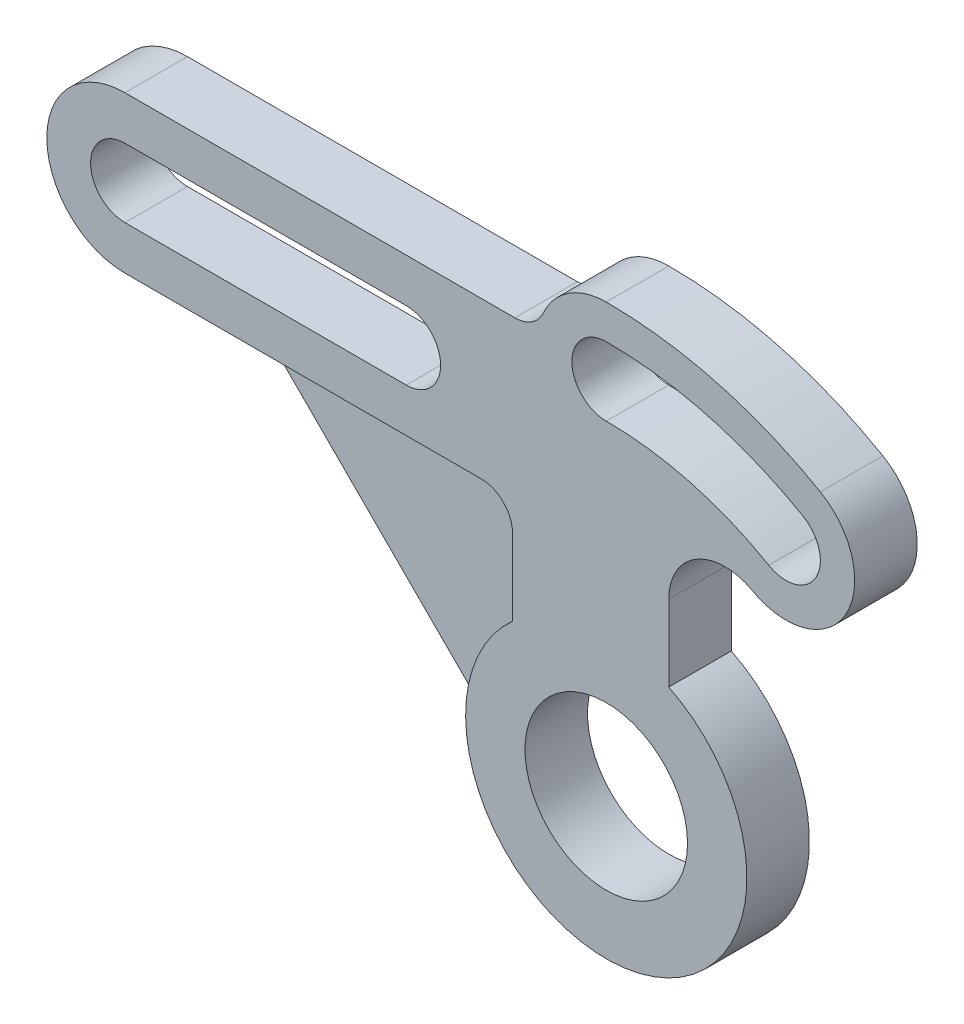
ISO-10303-21;
HEADER;
FILE_DESCRIPTION(('STEP AP214'),'2;1');
FILE_NAME('part.step','',(''),(''),'','','');
FILE_SCHEMA(('AUTOMOTIVE_DESIGN { 1 0 10303 214 1 1 1 1 }'));
ENDSEC;
DATA;
#1=APPLICATION_CONTEXT('core data for automotive mechanical design processes');
#2=APPLICATION_PROTOCOL_DEFINITION('international standard','automotive_design',2000,#1);
#3=PRODUCT_CONTEXT('',#1,'mechanical');
#4=PRODUCT('Part','Part','',(#3));
#5=PRODUCT_RELATED_PRODUCT_CATEGORY('part','',(#4));
#6=PRODUCT_DEFINITION_FORMATION('','',#4);
#7=PRODUCT_DEFINITION_CONTEXT('part definition',#1,'design');
#8=PRODUCT_DEFINITION('design','',#6,#7);
#9=PRODUCT_DEFINITION_SHAPE('','',#8);
#10=(LENGTH_UNIT() NAMED_UNIT(*) SI_UNIT(.MILLI.,.METRE.));
#11=(NAMED_UNIT(*) PLANE_ANGLE_UNIT() SI_UNIT($,.RADIAN.));
#12=(NAMED_UNIT(*) SI_UNIT($,.STERADIAN.) SOLID_ANGLE_UNIT());
#13=UNCERTAINTY_MEASURE_WITH_UNIT(LENGTH_MEASURE(1.E-05),#10,'distance_accuracy_value','');
#14=(GEOMETRIC_REPRESENTATION_CONTEXT(3) GLOBAL_UNCERTAINTY_ASSIGNED_CONTEXT((#13)) GLOBAL_UNIT_ASSIGNED_CONTEXT((#10,
#11,#12)) REPRESENTATION_CONTEXT('',''));
#15=CARTESIAN_POINT('',(0.,0.,0.));
#16=DIRECTION('',(0.,0.,1.));
#17=DIRECTION('',(1.,0.,0.));
#18=AXIS2_PLACEMENT_3D('',#15,#16,#17);
#19=CARTESIAN_POINT('',(-40.,-35.,10.));
#20=DIRECTION('',(0.,0.,-1.));
#21=DIRECTION('',(-1.,0.,0.));
#22=AXIS2_PLACEMENT_3D('',#19,#20,#21);
#23=CYLINDRICAL_SURFACE('',#22,10.);
#24=CARTESIAN_POINT('',(-40.,-35.,-5.));
#25=DIRECTION('',(0.,0.,1.));
#26=DIRECTION('',(1.,0.,0.));
#27=AXIS2_PLACEMENT_3D('',#24,#25,#26);
#28=CIRCLE('',#27,10.);
#29=CARTESIAN_POINT('',(-40.,-25.,-5.));
#30=VERTEX_POINT('',#29);
#31=CARTESIAN_POINT('',(-30.,-35.0000000000001,-5.));
#32=VERTEX_POINT('',#31);
#33=EDGE_CURVE('E516',#30,#32,#28,.F.);
#34=ORIENTED_EDGE('',*,*,#33,.F.);
#35=DIRECTION('',(0.,0.,-1.));
#36=VECTOR('',#35,1.);
#37=CARTESIAN_POINT('',(-40.,-25.,10.));
#38=LINE('',#37,#36);
#39=CARTESIAN_POINT('',(-40.,-25.,-10.));
#40=VERTEX_POINT('',#39);
#41=EDGE_CURVE('E437',#30,#40,#38,.T.);
#42=ORIENTED_EDGE('',*,*,#41,.T.);
#43=CARTESIAN_POINT('',(-40.,-35.,-10.));
#44=DIRECTION('',(0.,0.,1.));
#45=DIRECTION('',(1.,0.,0.));
#46=AXIS2_PLACEMENT_3D('',#43,#44,#45);
#47=CIRCLE('',#46,10.);
#48=CARTESIAN_POINT('',(-30.,-35.0000000000001,-10.));
#49=VERTEX_POINT('',#48);
#50=EDGE_CURVE('E352',#40,#49,#47,.F.);
#51=ORIENTED_EDGE('',*,*,#50,.T.);
#52=DIRECTION('',(0.,0.,-1.));
#53=VECTOR('',#52,1.);
#54=CARTESIAN_POINT('',(-30.,-35.0000000000001,10.));
#55=LINE('',#54,#53);
#56=EDGE_CURVE('E432',#32,#49,#55,.T.);
#57=ORIENTED_EDGE('',*,*,#56,.F.);
#58=EDGE_LOOP('',(#34,#42,#51,#57));
#59=FACE_BOUND('',#58,.T.);
#60=ADVANCED_FACE('F40',(#59),#23,.F.);
#61=CARTESIAN_POINT('',(-30.,0.,10.));
#62=DIRECTION('',(1.,0.,0.));
#63=DIRECTION('',(0.,1.,0.));
#64=AXIS2_PLACEMENT_3D('',#61,#62,#63);
#65=PLANE('',#64);
#66=DIRECTION('',(0.,-1.,0.));
#67=VECTOR('',#66,1.);
#68=CARTESIAN_POINT('',(-30.,0.,-5.));
#69=LINE('',#68,#67);
#70=CARTESIAN_POINT('',(-30.,-59.4589803375032,-5.));
#71=VERTEX_POINT('',#70);
#72=EDGE_CURVE('E256',#32,#71,#69,.T.);
#73=ORIENTED_EDGE('',*,*,#72,.F.);
#74=ORIENTED_EDGE('',*,*,#56,.T.);
#75=DIRECTION('',(0.,-1.,0.));
#76=VECTOR('',#75,1.);
#77=CARTESIAN_POINT('',(-30.,0.,-10.));
#78=LINE('',#77,#76);
#79=CARTESIAN_POINT('',(-30.,-59.4589803375032,-10.));
#80=VERTEX_POINT('',#79);
#81=EDGE_CURVE('E356',#49,#80,#78,.T.);
#82=ORIENTED_EDGE('',*,*,#81,.T.);
#83=DIRECTION('',(0.,0.,-1.));
#84=VECTOR('',#83,1.);
#85=CARTESIAN_POINT('',(-30.,-59.4589803375032,10.));
#86=LINE('',#85,#84);
#87=EDGE_CURVE('E428',#71,#80,#86,.T.);
#88=ORIENTED_EDGE('',*,*,#87,.F.);
#89=EDGE_LOOP('',(#73,#74,#82,#88));
#90=FACE_BOUND('',#89,.T.);
#91=ADVANCED_FACE('F557',(#90),#65,.F.);
#92=CARTESIAN_POINT('',(-64.,0.,10.));
#93=DIRECTION('',(0.,0.,-1.));
#94=DIRECTION('',(-1.,0.,0.));
#95=AXIS2_PLACEMENT_3D('',#92,#93,#94);
#96=CYLINDRICAL_SURFACE('',#95,11.);
#97=CARTESIAN_POINT('',(-64.,0.,-10.));
#98=DIRECTION('',(0.,0.,1.));
#99=DIRECTION('',(1.,0.,0.));
#100=AXIS2_PLACEMENT_3D('',#97,#98,#99);
#101=CIRCLE('',#100,11.);
#102=CARTESIAN_POINT('',(-64.,-11.,-10.));
#103=VERTEX_POINT('',#102);
#104=CARTESIAN_POINT('',(-64.,11.,-10.));
#105=VERTEX_POINT('',#104);
#106=EDGE_CURVE('E384',#103,#105,#101,.T.);
#107=ORIENTED_EDGE('',*,*,#106,.F.);
#108=DIRECTION('',(0.,0.,-1.));
#109=VECTOR('',#108,1.);
#110=CARTESIAN_POINT('',(-64.,-11.,10.));
#111=LINE('',#110,#109);
#112=CARTESIAN_POINT('',(-64.,-11.,10.));
#113=VERTEX_POINT('',#112);
#114=EDGE_CURVE('E409',#113,#103,#111,.T.);
#115=ORIENTED_EDGE('',*,*,#114,.F.);
#116=CARTESIAN_POINT('',(-64.,0.,10.));
#117=DIRECTION('',(0.,0.,1.));
#118=DIRECTION('',(1.,0.,0.));
#119=AXIS2_PLACEMENT_3D('',#116,#117,#118);
#120=CIRCLE('',#119,11.);
#121=CARTESIAN_POINT('',(-64.,11.,10.));
#122=VERTEX_POINT('',#121);
#123=EDGE_CURVE('E304',#113,#122,#120,.T.);
#124=ORIENTED_EDGE('',*,*,#123,.T.);
#125=DIRECTION('',(0.,0.,-1.));
#126=VECTOR('',#125,1.);
#127=CARTESIAN_POINT('',(-64.,11.,10.));
#128=LINE('',#127,#126);
#129=EDGE_CURVE('E399',#122,#105,#128,.T.);
#130=ORIENTED_EDGE('',*,*,#129,.T.);
#131=EDGE_LOOP('',(#107,#115,#124,#130));
#132=FACE_BOUND('',#131,.T.);
#133=ADVANCED_FACE('F584',(#132),#96,.F.);
#134=CARTESIAN_POINT('',(0.,-11.,10.));
#135=DIRECTION('',(0.,1.,0.));
#136=DIRECTION('',(0.,0.,1.));
#137=AXIS2_PLACEMENT_3D('',#134,#135,#136);
#138=PLANE('',#137);
#139=DIRECTION('',(1.,0.,0.));
#140=VECTOR('',#139,1.);
#141=CARTESIAN_POINT('',(0.,-11.,-10.));
#142=LINE('',#141,#140);
#143=CARTESIAN_POINT('',(-154.,-11.,-10.));
#144=VERTEX_POINT('',#143);
#145=EDGE_CURVE('E388',#144,#103,#142,.T.);
#146=ORIENTED_EDGE('',*,*,#145,.F.);
#147=DIRECTION('',(0.,0.,-1.));
#148=VECTOR('',#147,1.);
#149=CARTESIAN_POINT('',(-154.,-11.,10.));
#150=LINE('',#149,#148);
#151=CARTESIAN_POINT('',(-154.,-11.,10.));
#152=VERTEX_POINT('',#151);
#153=EDGE_CURVE('E406',#152,#144,#150,.T.);
#154=ORIENTED_EDGE('',*,*,#153,.F.);
#155=DIRECTION('',(1.,0.,0.));
#156=VECTOR('',#155,1.);
#157=CARTESIAN_POINT('',(0.,-11.,10.));
#158=LINE('',#157,#156);
#159=EDGE_CURVE('E308',#152,#113,#158,.T.);
#160=ORIENTED_EDGE('',*,*,#159,.T.);
#161=ORIENTED_EDGE('',*,*,#114,.T.);
#162=EDGE_LOOP('',(#146,#154,#160,#161));
#163=FACE_BOUND('',#162,.T.);
#164=ADVANCED_FACE('F645',(#163),#138,.T.);
#165=CARTESIAN_POINT('',(-154.,0.,10.));
#166=DIRECTION('',(0.,0.,-1.));
#167=DIRECTION('',(-1.,0.,0.));
#168=AXIS2_PLACEMENT_3D('',#165,#166,#167);
#169=CYLINDRICAL_SURFACE('',#168,11.);
#170=CARTESIAN_POINT('',(-154.,0.,-10.));
#171=DIRECTION('',(0.,0.,1.));
#172=DIRECTION('',(1.,0.,0.));
#173=AXIS2_PLACEMENT_3D('',#170,#171,#172);
#174=CIRCLE('',#173,11.);
#175=CARTESIAN_POINT('',(-154.,11.,-10.));
#176=VERTEX_POINT('',#175);
#177=EDGE_CURVE('E392',#176,#144,#174,.T.);
#178=ORIENTED_EDGE('',*,*,#177,.F.);
#179=DIRECTION('',(0.,0.,-1.));
#180=VECTOR('',#179,1.);
#181=CARTESIAN_POINT('',(-154.,11.,10.));
#182=LINE('',#181,#180);
#183=CARTESIAN_POINT('',(-154.,11.,10.));
#184=VERTEX_POINT('',#183);
#185=EDGE_CURVE('E402',#184,#176,#182,.T.);
#186=ORIENTED_EDGE('',*,*,#185,.F.);
#187=CARTESIAN_POINT('',(-154.,0.,10.));
#188=DIRECTION('',(0.,0.,1.));
#189=DIRECTION('',(1.,0.,0.));
#190=AXIS2_PLACEMENT_3D('',#187,#188,#189);
#191=CIRCLE('',#190,11.);
#192=EDGE_CURVE('E312',#184,#152,#191,.T.);
#193=ORIENTED_EDGE('',*,*,#192,.T.);
#194=ORIENTED_EDGE('',*,*,#153,.T.);
#195=EDGE_LOOP('',(#178,#186,#193,#194));
#196=FACE_BOUND('',#195,.T.);
#197=ADVANCED_FACE('F641',(#196),#169,.F.);
#198=CARTESIAN_POINT('',(0.,22.,10.));
#199=DIRECTION('',(0.,0.,-1.));
#200=DIRECTION('',(-1.,0.,0.));
#201=AXIS2_PLACEMENT_3D('',#198,#199,#200);
#202=CYLINDRICAL_SURFACE('',#201,11.);
#203=CARTESIAN_POINT('',(0.,22.,-10.));
#204=DIRECTION('',(0.,0.,1.));
#205=DIRECTION('',(1.,0.,0.));
#206=AXIS2_PLACEMENT_3D('',#203,#204,#205);
#207=CIRCLE('',#206,11.);
#208=CARTESIAN_POINT('',(0.,33.,-10.));
#209=VERTEX_POINT('',#208);
#210=CARTESIAN_POINT('',(0.,11.,-10.));
#211=VERTEX_POINT('',#210);
#212=EDGE_CURVE('E368',#209,#211,#207,.T.);
#213=ORIENTED_EDGE('',*,*,#212,.F.);
#214=DIRECTION('',(0.,0.,-1.));
#215=VECTOR('',#214,1.);
#216=CARTESIAN_POINT('',(0.,33.,10.));
#217=LINE('',#216,#215);
#218=CARTESIAN_POINT('',(0.,33.,10.));
#219=VERTEX_POINT('',#218);
#220=EDGE_CURVE('E403',#219,#209,#217,.T.);
#221=ORIENTED_EDGE('',*,*,#220,.F.);
#222=CARTESIAN_POINT('',(0.,22.,10.));
#223=DIRECTION('',(0.,0.,1.));
#224=DIRECTION('',(1.,0.,0.));
#225=AXIS2_PLACEMENT_3D('',#222,#223,#224);
#226=CIRCLE('',#225,11.);
#227=CARTESIAN_POINT('',(0.,11.,10.));
#228=VERTEX_POINT('',#227);
#229=EDGE_CURVE('E289',#219,#228,#226,.T.);
#230=ORIENTED_EDGE('',*,*,#229,.T.);
#231=DIRECTION('',(0.,0.,-1.));
#232=VECTOR('',#231,1.);
#233=CARTESIAN_POINT('',(0.,11.,10.));
#234=LINE('',#233,#232);
#235=EDGE_CURVE('E232',#228,#211,#234,.T.);
#236=ORIENTED_EDGE('',*,*,#235,.T.);
#237=EDGE_LOOP('',(#213,#221,#230,#236));
#238=FACE_BOUND('',#237,.T.);
#239=ADVANCED_FACE('F644',(#238),#202,.F.);
#240=CARTESIAN_POINT('',(0.,-93.,10.));
#241=DIRECTION('',(0.,0.,-1.));
#242=DIRECTION('',(-1.,0.,0.));
#243=AXIS2_PLACEMENT_3D('',#240,#241,#242);
#244=CYLINDRICAL_SURFACE('',#243,126.);
#245=CARTESIAN_POINT('',(0.,-93.,-10.));
#246=DIRECTION('',(0.,0.,1.));
#247=DIRECTION('',(1.,0.,0.));
#248=AXIS2_PLACEMENT_3D('',#245,#246,#247);
#249=CIRCLE('',#248,126.);
#250=CARTESIAN_POINT('',(62.9999999999994,16.1192008768397,-10.));
#251=VERTEX_POINT('',#250);
#252=EDGE_CURVE('E372',#251,#209,#249,.T.);
#253=ORIENTED_EDGE('',*,*,#252,.F.);
#254=DIRECTION('',(0.,0.,-1.));
#255=VECTOR('',#254,1.);
#256=CARTESIAN_POINT('',(62.9999999999994,16.1192008768397,10.));
#257=LINE('',#256,#255);
#258=CARTESIAN_POINT('',(62.9999999999994,16.1192008768397,10.));
#259=VERTEX_POINT('',#258);
#260=EDGE_CURVE('E418',#259,#251,#257,.T.);
#261=ORIENTED_EDGE('',*,*,#260,.F.);
#262=CARTESIAN_POINT('',(0.,-93.,10.));
#263=DIRECTION('',(0.,0.,1.));
#264=DIRECTION('',(1.,0.,0.));
#265=AXIS2_PLACEMENT_3D('',#262,#263,#264);
#266=CIRCLE('',#265,126.);
#267=EDGE_CURVE('E293',#259,#219,#266,.T.);
#268=ORIENTED_EDGE('',*,*,#267,.T.);
#269=ORIENTED_EDGE('',*,*,#220,.T.);
#270=EDGE_LOOP('',(#253,#261,#268,#269));
#271=FACE_BOUND('',#270,.T.);
#272=ADVANCED_FACE('F655',(#271),#244,.F.);
#273=CARTESIAN_POINT('',(57.4999999999994,6.5929214352108,10.));
#274=DIRECTION('',(0.,0.,-1.));
#275=DIRECTION('',(-1.,0.,0.));
#276=AXIS2_PLACEMENT_3D('',#273,#274,#275);
#277=CYLINDRICAL_SURFACE('',#276,11.);
#278=CARTESIAN_POINT('',(57.4999999999994,6.5929214352108,-10.));
#279=DIRECTION('',(0.,0.,1.));
#280=DIRECTION('',(1.,0.,0.));
#281=AXIS2_PLACEMENT_3D('',#278,#279,#280);
#282=CIRCLE('',#281,11.);
#283=CARTESIAN_POINT('',(51.9999999999995,-2.93335800641803,-10.));
#284=VERTEX_POINT('',#283);
#285=EDGE_CURVE('E376',#284,#251,#282,.T.);
#286=ORIENTED_EDGE('',*,*,#285,.F.);
#287=DIRECTION('',(0.,0.,-1.));
#288=VECTOR('',#287,1.);
#289=CARTESIAN_POINT('',(51.9999999999995,-2.93335800641803,10.));
#290=LINE('',#289,#288);
#291=CARTESIAN_POINT('',(51.9999999999995,-2.93335800641803,10.));
#292=VERTEX_POINT('',#291);
#293=EDGE_CURVE('E415',#292,#284,#290,.T.);
#294=ORIENTED_EDGE('',*,*,#293,.F.);
#295=CARTESIAN_POINT('',(57.4999999999994,6.5929214352108,10.));
#296=DIRECTION('',(0.,0.,1.));
#297=DIRECTION('',(1.,0.,0.));
#298=AXIS2_PLACEMENT_3D('',#295,#296,#297);
#299=CIRCLE('',#298,11.);
#300=EDGE_CURVE('E297',#292,#259,#299,.T.);
#301=ORIENTED_EDGE('',*,*,#300,.T.);
#302=ORIENTED_EDGE('',*,*,#260,.T.);
#303=EDGE_LOOP('',(#286,#294,#301,#302));
#304=FACE_BOUND('',#303,.T.);
#305=ADVANCED_FACE('F620',(#304),#277,.F.);
#306=CARTESIAN_POINT('',(37.9999999999999,-28.3262691006696,10.));
#307=DIRECTION('',(0.,0.,-1.));
#308=DIRECTION('',(-1.,0.,0.));
#309=AXIS2_PLACEMENT_3D('',#306,#307,#308);
#310=CYLINDRICAL_SURFACE('',#309,18.);
#311=CARTESIAN_POINT('',(37.9999999999999,-28.3262691006696,-10.));
#312=DIRECTION('',(0.,0.,1.));
#313=DIRECTION('',(1.,0.,0.));
#314=AXIS2_PLACEMENT_3D('',#311,#312,#313);
#315=CIRCLE('',#314,18.);
#316=CARTESIAN_POINT('',(46.4999999999995,-12.4596374480469,-10.));
#317=VERTEX_POINT('',#316);
#318=CARTESIAN_POINT('',(19.9999999999999,-28.3262691006696,-10.));
#319=VERTEX_POINT('',#318);
#320=EDGE_CURVE('E228',#317,#319,#315,.T.);
#321=ORIENTED_EDGE('',*,*,#320,.F.);
#322=DIRECTION('',(0.,0.,-1.));
#323=VECTOR('',#322,1.);
#324=CARTESIAN_POINT('',(46.4999999999995,-12.4596374480469,10.));
#325=LINE('',#324,#323);
#326=CARTESIAN_POINT('',(46.4999999999995,-12.4596374480469,10.));
#327=VERTEX_POINT('',#326);
#328=EDGE_CURVE('E221',#327,#317,#325,.T.);
#329=ORIENTED_EDGE('',*,*,#328,.F.);
#330=CARTESIAN_POINT('',(37.9999999999999,-28.3262691006696,10.));
#331=DIRECTION('',(0.,0.,1.));
#332=DIRECTION('',(1.,0.,0.));
#333=AXIS2_PLACEMENT_3D('',#330,#331,#332);
#334=CIRCLE('',#333,18.);
#335=CARTESIAN_POINT('',(19.9999999999999,-28.3262691006696,10.));
#336=VERTEX_POINT('',#335);
#337=EDGE_CURVE('E225',#327,#336,#334,.T.);
#338=ORIENTED_EDGE('',*,*,#337,.T.);
#339=DIRECTION('',(0.,0.,-1.));
#340=VECTOR('',#339,1.);
#341=CARTESIAN_POINT('',(19.9999999999999,-28.3262691006696,10.));
#342=LINE('',#341,#340);
#343=EDGE_CURVE('E323',#336,#319,#342,.T.);
#344=ORIENTED_EDGE('',*,*,#343,.T.);
#345=EDGE_LOOP('',(#321,#329,#338,#344));
#346=FACE_BOUND('',#345,.T.);
#347=ADVANCED_FACE('F223',(#346),#310,.F.);
#348=CARTESIAN_POINT('',(57.4999999999994,6.5929214352108,10.));
#349=DIRECTION('',(0.,0.,-1.));
#350=DIRECTION('',(-1.,0.,0.));
#351=AXIS2_PLACEMENT_3D('',#348,#349,#350);
#352=CYLINDRICAL_SURFACE('',#351,22.);
#353=CARTESIAN_POINT('',(57.4999999999994,6.5929214352108,-10.));
#354=DIRECTION('',(0.,0.,1.));
#355=DIRECTION('',(1.,0.,0.));
#356=AXIS2_PLACEMENT_3D('',#353,#354,#355);
#357=CIRCLE('',#356,22.);
#358=CARTESIAN_POINT('',(68.4999999999994,25.6454803184685,-10.));
#359=VERTEX_POINT('',#358);
#360=EDGE_CURVE('E326',#317,#359,#357,.T.);
#361=ORIENTED_EDGE('',*,*,#360,.T.);
#362=DIRECTION('',(0.,0.,-1.));
#363=VECTOR('',#362,1.);
#364=CARTESIAN_POINT('',(68.4999999999994,25.6454803184685,10.));
#365=LINE('',#364,#363);
#366=CARTESIAN_POINT('',(68.4999999999994,25.6454803184685,10.));
#367=VERTEX_POINT('',#366);
#368=EDGE_CURVE('E233',#367,#359,#365,.T.);
#369=ORIENTED_EDGE('',*,*,#368,.F.);
#370=CARTESIAN_POINT('',(57.4999999999994,6.5929214352108,10.));
#371=DIRECTION('',(0.,0.,1.));
#372=DIRECTION('',(1.,0.,0.));
#373=AXIS2_PLACEMENT_3D('',#370,#371,#372);
#374=CIRCLE('',#373,22.);
#375=EDGE_CURVE('E236',#327,#367,#374,.T.);
#376=ORIENTED_EDGE('',*,*,#375,.F.);
#377=ORIENTED_EDGE('',*,*,#328,.T.);
#378=EDGE_LOOP('',(#361,#369,#376,#377));
#379=FACE_BOUND('',#378,.T.);
#380=ADVANCED_FACE('F237',(#379),#352,.T.);
#381=CARTESIAN_POINT('',(0.,-93.,10.));
#382=DIRECTION('',(0.,0.,-1.));
#383=DIRECTION('',(-1.,0.,0.));
#384=AXIS2_PLACEMENT_3D('',#381,#382,#383);
#385=CYLINDRICAL_SURFACE('',#384,137.);
#386=CARTESIAN_POINT('',(0.,-93.,-10.));
#387=DIRECTION('',(0.,0.,1.));
#388=DIRECTION('',(1.,0.,0.));
#389=AXIS2_PLACEMENT_3D('',#386,#387,#388);
#390=CIRCLE('',#389,137.);
#391=CARTESIAN_POINT('',(0.,44.,-10.));
#392=VERTEX_POINT('',#391);
#393=EDGE_CURVE('E330',#359,#392,#390,.T.);
#394=ORIENTED_EDGE('',*,*,#393,.T.);
#395=DIRECTION('',(0.,0.,-1.));
#396=VECTOR('',#395,1.);
#397=CARTESIAN_POINT('',(0.,44.,10.));
#398=LINE('',#397,#396);
#399=CARTESIAN_POINT('',(0.,44.,10.));
#400=VERTEX_POINT('',#399);
#401=EDGE_CURVE('E455',#400,#392,#398,.T.);
#402=ORIENTED_EDGE('',*,*,#401,.F.);
#403=CARTESIAN_POINT('',(0.,-93.,10.));
#404=DIRECTION('',(0.,0.,1.));
#405=DIRECTION('',(1.,0.,0.));
#406=AXIS2_PLACEMENT_3D('',#403,#404,#405);
#407=CIRCLE('',#406,137.);
#408=EDGE_CURVE('E242',#367,#400,#407,.T.);
#409=ORIENTED_EDGE('',*,*,#408,.F.);
#410=ORIENTED_EDGE('',*,*,#368,.T.);
#411=EDGE_LOOP('',(#394,#402,#409,#410));
#412=FACE_BOUND('',#411,.T.);
#413=ADVANCED_FACE('F612',(#412),#385,.T.);
#414=CARTESIAN_POINT('',(0.,22.,10.));
#415=DIRECTION('',(0.,0.,-1.));
#416=DIRECTION('',(-1.,0.,0.));
#417=AXIS2_PLACEMENT_3D('',#414,#415,#416);
#418=CYLINDRICAL_SURFACE('',#417,22.);
#419=CARTESIAN_POINT('',(0.,22.,-10.));
#420=DIRECTION('',(0.,0.,1.));
#421=DIRECTION('',(1.,0.,0.));
#422=AXIS2_PLACEMENT_3D('',#419,#420,#421);
#423=CIRCLE('',#422,22.);
#424=CARTESIAN_POINT('',(-20.1027633361685,30.9375,-10.));
#425=VERTEX_POINT('',#424);
#426=EDGE_CURVE('E333',#392,#425,#423,.T.);
#427=ORIENTED_EDGE('',*,*,#426,.T.);
#428=DIRECTION('',(0.,0.,-1.));
#429=VECTOR('',#428,1.);
#430=CARTESIAN_POINT('',(-20.1027633361685,30.9375,10.));
#431=LINE('',#430,#429);
#432=CARTESIAN_POINT('',(-20.1027633361685,30.9375,10.));
#433=VERTEX_POINT('',#432);
#434=EDGE_CURVE('E452',#433,#425,#431,.T.);
#435=ORIENTED_EDGE('',*,*,#434,.F.);
#436=CARTESIAN_POINT('',(0.,22.,10.));
#437=DIRECTION('',(0.,0.,1.));
#438=DIRECTION('',(1.,0.,0.));
#439=AXIS2_PLACEMENT_3D('',#436,#437,#438);
#440=CIRCLE('',#439,22.);
#441=EDGE_CURVE('E261',#400,#433,#440,.T.);
#442=ORIENTED_EDGE('',*,*,#441,.F.);
#443=ORIENTED_EDGE('',*,*,#401,.T.);
#444=EDGE_LOOP('',(#427,#435,#442,#443));
#445=FACE_BOUND('',#444,.T.);
#446=ADVANCED_FACE('F608',(#445),#418,.T.);
#447=CARTESIAN_POINT('',(-29.2403830344269,35.,10.));
#448=DIRECTION('',(0.,0.,-1.));
#449=DIRECTION('',(-1.,0.,0.));
#450=AXIS2_PLACEMENT_3D('',#447,#448,#449);
#451=CYLINDRICAL_SURFACE('',#450,10.);
#452=CARTESIAN_POINT('',(-29.2403830344269,35.,-10.));
#453=DIRECTION('',(0.,0.,1.));
#454=DIRECTION('',(1.,0.,0.));
#455=AXIS2_PLACEMENT_3D('',#452,#453,#454);
#456=CIRCLE('',#455,10.);
#457=CARTESIAN_POINT('',(-29.2403830344269,25.,-10.));
#458=VERTEX_POINT('',#457);
#459=EDGE_CURVE('E337',#458,#425,#456,.T.);
#460=ORIENTED_EDGE('',*,*,#459,.F.);
#461=DIRECTION('',(0.,0.,-1.));
#462=VECTOR('',#461,1.);
#463=CARTESIAN_POINT('',(-29.2403830344269,25.,10.));
#464=LINE('',#463,#462);
#465=CARTESIAN_POINT('',(-29.2403830344269,25.,10.));
#466=VERTEX_POINT('',#465);
#467=EDGE_CURVE('E449',#466,#458,#464,.T.);
#468=ORIENTED_EDGE('',*,*,#467,.F.);
#469=CARTESIAN_POINT('',(-29.2403830344269,35.,10.));
#470=DIRECTION('',(0.,0.,1.));
#471=DIRECTION('',(1.,0.,0.));
#472=AXIS2_PLACEMENT_3D('',#469,#470,#471);
#473=CIRCLE('',#472,10.);
#474=EDGE_CURVE('E264',#466,#433,#473,.T.);
#475=ORIENTED_EDGE('',*,*,#474,.T.);
#476=ORIENTED_EDGE('',*,*,#434,.T.);
#477=EDGE_LOOP('',(#460,#468,#475,#476));
#478=FACE_BOUND('',#477,.T.);
#479=ADVANCED_FACE('F604',(#478),#451,.F.);
#480=CARTESIAN_POINT('',(0.,25.,10.));
#481=DIRECTION('',(0.,1.,0.));
#482=DIRECTION('',(0.,0.,1.));
#483=AXIS2_PLACEMENT_3D('',#480,#481,#482);
#484=PLANE('',#483);
#485=DIRECTION('',(1.,0.,0.));
#486=VECTOR('',#485,1.);
#487=CARTESIAN_POINT('',(0.,25.,-10.));
#488=LINE('',#487,#486);
#489=CARTESIAN_POINT('',(-154.,25.,-10.));
#490=VERTEX_POINT('',#489);
#491=EDGE_CURVE('E341',#490,#458,#488,.T.);
#492=ORIENTED_EDGE('',*,*,#491,.F.);
#493=DIRECTION('',(0.,0.,-1.));
#494=VECTOR('',#493,1.);
#495=CARTESIAN_POINT('',(-154.,25.,10.));
#496=LINE('',#495,#494);
#497=CARTESIAN_POINT('',(-154.,25.,10.));
#498=VERTEX_POINT('',#497);
#499=EDGE_CURVE('E446',#498,#490,#496,.T.);
#500=ORIENTED_EDGE('',*,*,#499,.F.);
#501=DIRECTION('',(1.,0.,0.));
#502=VECTOR('',#501,1.);
#503=CARTESIAN_POINT('',(0.,25.,10.));
#504=LINE('',#503,#502);
#505=EDGE_CURVE('E268',#498,#466,#504,.T.);
#506=ORIENTED_EDGE('',*,*,#505,.T.);
#507=ORIENTED_EDGE('',*,*,#467,.T.);
#508=EDGE_LOOP('',(#492,#500,#506,#507));
#509=FACE_BOUND('',#508,.T.);
#510=ADVANCED_FACE('F598',(#509),#484,.T.);
#511=CARTESIAN_POINT('',(-154.,0.,10.));
#512=DIRECTION('',(0.,0.,-1.));
#513=DIRECTION('',(-1.,0.,0.));
#514=AXIS2_PLACEMENT_3D('',#511,#512,#513);
#515=CYLINDRICAL_SURFACE('',#514,25.);
#516=CARTESIAN_POINT('',(-154.,0.,-10.));
#517=DIRECTION('',(0.,0.,1.));
#518=DIRECTION('',(1.,0.,0.));
#519=AXIS2_PLACEMENT_3D('',#516,#517,#518);
#520=CIRCLE('',#519,25.);
#521=CARTESIAN_POINT('',(-154.,-25.,-10.));
#522=VERTEX_POINT('',#521);
#523=EDGE_CURVE('E345',#490,#522,#520,.T.);
#524=ORIENTED_EDGE('',*,*,#523,.T.);
#525=DIRECTION('',(0.,0.,-1.));
#526=VECTOR('',#525,1.);
#527=CARTESIAN_POINT('',(-154.,-25.,10.));
#528=LINE('',#527,#526);
#529=CARTESIAN_POINT('',(-154.,-25.,10.));
#530=VERTEX_POINT('',#529);
#531=EDGE_CURVE('E442',#530,#522,#528,.T.);
#532=ORIENTED_EDGE('',*,*,#531,.F.);
#533=CARTESIAN_POINT('',(-154.,0.,10.));
#534=DIRECTION('',(0.,0.,1.));
#535=DIRECTION('',(1.,0.,0.));
#536=AXIS2_PLACEMENT_3D('',#533,#534,#535);
#537=CIRCLE('',#536,25.);
#538=EDGE_CURVE('E272',#498,#530,#537,.T.);
#539=ORIENTED_EDGE('',*,*,#538,.F.);
#540=ORIENTED_EDGE('',*,*,#499,.T.);
#541=EDGE_LOOP('',(#524,#532,#539,#540));
#542=FACE_BOUND('',#541,.T.);
#543=ADVANCED_FACE('F593',(#542),#515,.T.);
#544=CARTESIAN_POINT('',(0.,-25.,10.));
#545=DIRECTION('',(0.,1.,0.));
#546=DIRECTION('',(0.,0.,1.));
#547=AXIS2_PLACEMENT_3D('',#544,#545,#546);
#548=PLANE('',#547);
#549=DIRECTION('',(1.,0.,0.));
#550=VECTOR('',#549,1.);
#551=CARTESIAN_POINT('',(0.,-25.,-5.));
#552=LINE('',#551,#550);
#553=CARTESIAN_POINT('',(-120.455844122716,-25.,-5.));
#554=VERTEX_POINT('',#553);
#555=EDGE_CURVE('E495',#554,#30,#552,.T.);
#556=ORIENTED_EDGE('',*,*,#555,.F.);
#557=DIRECTION('',(0.,0.,-1.));
#558=VECTOR('',#557,1.);
#559=CARTESIAN_POINT('',(-120.455844122716,-25.,5.));
#560=LINE('',#559,#558);
#561=CARTESIAN_POINT('',(-120.455844122716,-25.,5.));
#562=VERTEX_POINT('',#561);
#563=EDGE_CURVE('E467',#554,#562,#560,.F.);
#564=ORIENTED_EDGE('',*,*,#563,.T.);
#565=DIRECTION('',(1.,0.,0.));
#566=VECTOR('',#565,1.);
#567=CARTESIAN_POINT('',(0.,-25.,5.));
#568=LINE('',#567,#566);
#569=CARTESIAN_POINT('',(-40.,-25.,5.));
#570=VERTEX_POINT('',#569);
#571=EDGE_CURVE('E505',#562,#570,#568,.T.);
#572=ORIENTED_EDGE('',*,*,#571,.T.);
#573=CARTESIAN_POINT('',(-40.,-25.,10.));
#574=VERTEX_POINT('',#573);
#575=EDGE_CURVE('E438',#574,#570,#38,.T.);
#576=ORIENTED_EDGE('',*,*,#575,.F.);
#577=DIRECTION('',(1.,0.,0.));
#578=VECTOR('',#577,1.);
#579=CARTESIAN_POINT('',(0.,-25.,10.));
#580=LINE('',#579,#578);
#581=EDGE_CURVE('E275',#530,#574,#580,.T.);
#582=ORIENTED_EDGE('',*,*,#581,.F.);
#583=ORIENTED_EDGE('',*,*,#531,.T.);
#584=DIRECTION('',(1.,0.,0.));
#585=VECTOR('',#584,1.);
#586=CARTESIAN_POINT('',(0.,-25.,-10.));
#587=LINE('',#586,#585);
#588=EDGE_CURVE('E348',#522,#40,#587,.T.);
#589=ORIENTED_EDGE('',*,*,#588,.T.);
#590=ORIENTED_EDGE('',*,*,#41,.F.);
#591=EDGE_LOOP('',(#556,#564,#572,#576,#582,#583,#589,#590));
#592=FACE_BOUND('',#591,.T.);
#593=ADVANCED_FACE('F540',(#592),#548,.F.);
#594=ORIENTED_EDGE('',*,*,#575,.T.);
#595=CARTESIAN_POINT('',(-40.,-35.,5.));
#596=DIRECTION('',(0.,0.,1.));
#597=DIRECTION('',(1.,0.,0.));
#598=AXIS2_PLACEMENT_3D('',#595,#596,#597);
#599=CIRCLE('',#598,10.);
#600=CARTESIAN_POINT('',(-30.,-35.0000000000001,5.));
#601=VERTEX_POINT('',#600);
#602=EDGE_CURVE('E510',#570,#601,#599,.F.);
#603=ORIENTED_EDGE('',*,*,#602,.T.);
#604=CARTESIAN_POINT('',(-30.,-35.0000000000001,10.));
#605=VERTEX_POINT('',#604);
#606=EDGE_CURVE('E433',#605,#601,#55,.T.);
#607=ORIENTED_EDGE('',*,*,#606,.F.);
#608=CARTESIAN_POINT('',(-40.,-35.,10.));
#609=DIRECTION('',(0.,0.,1.));
#610=DIRECTION('',(1.,0.,0.));
#611=AXIS2_PLACEMENT_3D('',#608,#609,#610);
#612=CIRCLE('',#611,10.);
#613=EDGE_CURVE('E278',#574,#605,#612,.F.);
#614=ORIENTED_EDGE('',*,*,#613,.F.);
#615=EDGE_LOOP('',(#594,#603,#607,#614));
#616=FACE_BOUND('',#615,.T.);
#617=ADVANCED_FACE('F526',(#616),#23,.F.);
#618=ORIENTED_EDGE('',*,*,#606,.T.);
#619=DIRECTION('',(0.,-1.,0.));
#620=VECTOR('',#619,1.);
#621=CARTESIAN_POINT('',(-30.,0.,5.));
#622=LINE('',#621,#620);
#623=CARTESIAN_POINT('',(-30.,-59.4589803375032,5.));
#624=VERTEX_POINT('',#623);
#625=EDGE_CURVE('E327',#601,#624,#622,.T.);
#626=ORIENTED_EDGE('',*,*,#625,.T.);
#627=CARTESIAN_POINT('',(-30.,-59.4589803375032,10.));
#628=VERTEX_POINT('',#627);
#629=EDGE_CURVE('E429',#628,#624,#86,.T.);
#630=ORIENTED_EDGE('',*,*,#629,.F.);
#631=DIRECTION('',(0.,-1.,0.));
#632=VECTOR('',#631,1.);
#633=CARTESIAN_POINT('',(-30.,0.,10.));
#634=LINE('',#633,#632);
#635=EDGE_CURVE('E281',#605,#628,#634,.T.);
#636=ORIENTED_EDGE('',*,*,#635,.F.);
#637=EDGE_LOOP('',(#618,#626,#630,#636));
#638=FACE_BOUND('',#637,.T.);
#639=ADVANCED_FACE('F531',(#638),#65,.F.);
#640=CARTESIAN_POINT('',(0.,-93.,10.));
#641=DIRECTION('',(0.,0.,-1.));
#642=DIRECTION('',(-1.,0.,0.));
#643=AXIS2_PLACEMENT_3D('',#640,#641,#642);
#644=CYLINDRICAL_SURFACE('',#643,45.);
#645=DIRECTION('',(0.,0.,-1.));
#646=VECTOR('',#645,1.);
#647=CARTESIAN_POINT('',(-44.6392852941939,-98.6863176506032,10.));
#648=LINE('',#647,#646);
#649=CARTESIAN_POINT('',(-44.6392852941939,-98.6863176506032,5.));
#650=VERTEX_POINT('',#649);
#651=CARTESIAN_POINT('',(-44.6392852941939,-98.6863176506032,-5.));
#652=VERTEX_POINT('',#651);
#653=EDGE_CURVE('E471',#650,#652,#648,.T.);
#654=ORIENTED_EDGE('',*,*,#653,.T.);
#655=CARTESIAN_POINT('',(0.,-93.,-5.));
#656=DIRECTION('',(0.,0.,1.));
#657=DIRECTION('',(1.,0.,0.));
#658=AXIS2_PLACEMENT_3D('',#655,#656,#657);
#659=CIRCLE('',#658,45.);
#660=EDGE_CURVE('E56',#71,#652,#659,.T.);
#661=ORIENTED_EDGE('',*,*,#660,.F.);
#662=ORIENTED_EDGE('',*,*,#87,.T.);
#663=CARTESIAN_POINT('',(0.,-93.,-10.));
#664=DIRECTION('',(0.,0.,1.));
#665=DIRECTION('',(1.,0.,0.));
#666=AXIS2_PLACEMENT_3D('',#663,#664,#665);
#667=CIRCLE('',#666,45.);
#668=CARTESIAN_POINT('',(20.,-52.6887112585073,-10.));
#669=VERTEX_POINT('',#668);
#670=EDGE_CURVE('E360',#80,#669,#667,.T.);
#671=ORIENTED_EDGE('',*,*,#670,.T.);
#672=DIRECTION('',(0.,0.,-1.));
#673=VECTOR('',#672,1.);
#674=CARTESIAN_POINT('',(20.,-52.6887112585073,10.));
#675=LINE('',#674,#673);
#676=CARTESIAN_POINT('',(20.,-52.6887112585073,10.));
#677=VERTEX_POINT('',#676);
#678=EDGE_CURVE('E425',#677,#669,#675,.T.);
#679=ORIENTED_EDGE('',*,*,#678,.F.);
#680=CARTESIAN_POINT('',(0.,-93.,10.));
#681=DIRECTION('',(0.,0.,1.));
#682=DIRECTION('',(1.,0.,0.));
#683=AXIS2_PLACEMENT_3D('',#680,#681,#682);
#684=CIRCLE('',#683,45.);
#685=EDGE_CURVE('E284',#628,#677,#684,.T.);
#686=ORIENTED_EDGE('',*,*,#685,.F.);
#687=ORIENTED_EDGE('',*,*,#629,.T.);
#688=CARTESIAN_POINT('',(0.,-93.,5.));
#689=DIRECTION('',(0.,0.,1.));
#690=DIRECTION('',(1.,0.,0.));
#691=AXIS2_PLACEMENT_3D('',#688,#689,#690);
#692=CIRCLE('',#691,45.);
#693=EDGE_CURVE('E64',#624,#650,#692,.T.);
#694=ORIENTED_EDGE('',*,*,#693,.T.);
#695=EDGE_LOOP('',(#654,#661,#662,#671,#679,#686,#687,#694));
#696=FACE_BOUND('',#695,.T.);
#697=ADVANCED_FACE('F553',(#696),#644,.T.);
#698=CARTESIAN_POINT('',(0.,11.,10.));
#699=DIRECTION('',(0.,1.,0.));
#700=DIRECTION('',(0.,0.,1.));
#701=AXIS2_PLACEMENT_3D('',#698,#699,#700);
#702=PLANE('',#701);
#703=DIRECTION('',(1.,0.,0.));
#704=VECTOR('',#703,1.);
#705=CARTESIAN_POINT('',(0.,11.,-10.));
#706=LINE('',#705,#704);
#707=EDGE_CURVE('E253',#176,#105,#706,.T.);
#708=ORIENTED_EDGE('',*,*,#707,.T.);
#709=ORIENTED_EDGE('',*,*,#129,.F.);
#710=DIRECTION('',(1.,0.,0.));
#711=VECTOR('',#710,1.);
#712=CARTESIAN_POINT('',(0.,11.,10.));
#713=LINE('',#712,#711);
#714=EDGE_CURVE('E316',#184,#122,#713,.T.);
#715=ORIENTED_EDGE('',*,*,#714,.F.);
#716=ORIENTED_EDGE('',*,*,#185,.T.);
#717=EDGE_LOOP('',(#708,#709,#715,#716));
#718=FACE_BOUND('',#717,.T.);
#719=ADVANCED_FACE('F574',(#718),#702,.F.);
#720=CARTESIAN_POINT('',(0.,-93.,10.));
#721=DIRECTION('',(0.,0.,-1.));
#722=DIRECTION('',(-1.,0.,0.));
#723=AXIS2_PLACEMENT_3D('',#720,#721,#722);
#724=CYLINDRICAL_SURFACE('',#723,104.);
#725=CARTESIAN_POINT('',(0.,-93.,-10.));
#726=DIRECTION('',(0.,0.,1.));
#727=DIRECTION('',(1.,0.,0.));
#728=AXIS2_PLACEMENT_3D('',#725,#726,#727);
#729=CIRCLE('',#728,104.);
#730=EDGE_CURVE('E380',#284,#211,#729,.T.);
#731=ORIENTED_EDGE('',*,*,#730,.T.);
#732=ORIENTED_EDGE('',*,*,#235,.F.);
#733=CARTESIAN_POINT('',(0.,-93.,10.));
#734=DIRECTION('',(0.,0.,1.));
#735=DIRECTION('',(1.,0.,0.));
#736=AXIS2_PLACEMENT_3D('',#733,#734,#735);
#737=CIRCLE('',#736,104.);
#738=EDGE_CURVE('E301',#292,#228,#737,.T.);
#739=ORIENTED_EDGE('',*,*,#738,.F.);
#740=ORIENTED_EDGE('',*,*,#293,.T.);
#741=EDGE_LOOP('',(#731,#732,#739,#740));
#742=FACE_BOUND('',#741,.T.);
#743=ADVANCED_FACE('F566',(#742),#724,.T.);
#744=CARTESIAN_POINT('',(19.9999999999998,0.,10.));
#745=DIRECTION('',(1.,0.,0.));
#746=DIRECTION('',(0.,1.,0.));
#747=AXIS2_PLACEMENT_3D('',#744,#745,#746);
#748=PLANE('',#747);
#749=DIRECTION('',(0.,-1.,0.));
#750=VECTOR('',#749,1.);
#751=CARTESIAN_POINT('',(19.9999999999998,0.,-10.));
#752=LINE('',#751,#750);
#753=EDGE_CURVE('E364',#319,#669,#752,.T.);
#754=ORIENTED_EDGE('',*,*,#753,.F.);
#755=ORIENTED_EDGE('',*,*,#343,.F.);
#756=DIRECTION('',(0.,-1.,0.));
#757=VECTOR('',#756,1.);
#758=CARTESIAN_POINT('',(19.9999999999998,0.,10.));
#759=LINE('',#758,#757);
#760=EDGE_CURVE('E247',#336,#677,#759,.T.);
#761=ORIENTED_EDGE('',*,*,#760,.T.);
#762=ORIENTED_EDGE('',*,*,#678,.T.);
#763=EDGE_LOOP('',(#754,#755,#761,#762));
#764=FACE_BOUND('',#763,.T.);
#765=ADVANCED_FACE('F563',(#764),#748,.T.);
#766=CARTESIAN_POINT('',(0.,-93.,10.));
#767=DIRECTION('',(0.,0.,-1.));
#768=DIRECTION('',(-1.,0.,0.));
#769=AXIS2_PLACEMENT_3D('',#766,#767,#768);
#770=CYLINDRICAL_SURFACE('',#769,26.);
#771=CARTESIAN_POINT('',(0.,-93.,10.));
#772=DIRECTION('',(0.,0.,1.));
#773=DIRECTION('',(1.,0.,0.));
#774=AXIS2_PLACEMENT_3D('',#771,#772,#773);
#775=CIRCLE('',#774,26.);
#776=CARTESIAN_POINT('',(26.,-93.,10.));
#777=VERTEX_POINT('',#776);
#778=EDGE_CURVE('E319',#777,#777,#775,.T.);
#779=ORIENTED_EDGE('',*,*,#778,.T.);
#780=EDGE_LOOP('',(#779));
#781=FACE_BOUND('',#780,.T.);
#782=CARTESIAN_POINT('',(0.,-93.,-10.));
#783=DIRECTION('',(0.,0.,1.));
#784=DIRECTION('',(1.,0.,0.));
#785=AXIS2_PLACEMENT_3D('',#782,#783,#784);
#786=CIRCLE('',#785,26.);
#787=CARTESIAN_POINT('',(26.,-93.,-10.));
#788=VERTEX_POINT('',#787);
#789=EDGE_CURVE('E249',#788,#788,#786,.T.);
#790=ORIENTED_EDGE('',*,*,#789,.F.);
#791=EDGE_LOOP('',(#790));
#792=FACE_BOUND('',#791,.T.);
#793=ADVANCED_FACE('F565',(#781,#792),#770,.F.);
#794=CARTESIAN_POINT('',(0.,0.,10.));
#795=DIRECTION('',(0.,0.,1.));
#796=DIRECTION('',(1.,0.,0.));
#797=AXIS2_PLACEMENT_3D('',#794,#795,#796);
#798=PLANE('',#797);
#799=ORIENTED_EDGE('',*,*,#337,.F.);
#800=ORIENTED_EDGE('',*,*,#375,.T.);
#801=ORIENTED_EDGE('',*,*,#408,.T.);
#802=ORIENTED_EDGE('',*,*,#441,.T.);
#803=ORIENTED_EDGE('',*,*,#474,.F.);
#804=ORIENTED_EDGE('',*,*,#505,.F.);
#805=ORIENTED_EDGE('',*,*,#538,.T.);
#806=ORIENTED_EDGE('',*,*,#581,.T.);
#807=ORIENTED_EDGE('',*,*,#613,.T.);
#808=ORIENTED_EDGE('',*,*,#635,.T.);
#809=ORIENTED_EDGE('',*,*,#685,.T.);
#810=ORIENTED_EDGE('',*,*,#760,.F.);
#811=EDGE_LOOP('',(#799,#800,#801,#802,#803,#804,#805,#806,#807,#808,#809,#810));
#812=FACE_BOUND('',#811,.T.);
#813=ORIENTED_EDGE('',*,*,#229,.F.);
#814=ORIENTED_EDGE('',*,*,#267,.F.);
#815=ORIENTED_EDGE('',*,*,#300,.F.);
#816=ORIENTED_EDGE('',*,*,#738,.T.);
#817=EDGE_LOOP('',(#813,#814,#815,#816));
#818=FACE_BOUND('',#817,.T.);
#819=ORIENTED_EDGE('',*,*,#123,.F.);
#820=ORIENTED_EDGE('',*,*,#159,.F.);
#821=ORIENTED_EDGE('',*,*,#192,.F.);
#822=ORIENTED_EDGE('',*,*,#714,.T.);
#823=EDGE_LOOP('',(#819,#820,#821,#822));
#824=FACE_BOUND('',#823,.T.);
#825=ORIENTED_EDGE('',*,*,#778,.F.);
#826=EDGE_LOOP('',(#825));
#827=FACE_BOUND('',#826,.T.);
#828=ADVANCED_FACE('F244',(#812,#818,#824,#827),#798,.T.);
#829=CARTESIAN_POINT('',(0.,0.,-10.));
#830=DIRECTION('',(0.,0.,1.));
#831=DIRECTION('',(1.,0.,0.));
#832=AXIS2_PLACEMENT_3D('',#829,#830,#831);
#833=PLANE('',#832);
#834=ORIENTED_EDGE('',*,*,#320,.T.);
#835=ORIENTED_EDGE('',*,*,#753,.T.);
#836=ORIENTED_EDGE('',*,*,#670,.F.);
#837=ORIENTED_EDGE('',*,*,#81,.F.);
#838=ORIENTED_EDGE('',*,*,#50,.F.);
#839=ORIENTED_EDGE('',*,*,#588,.F.);
#840=ORIENTED_EDGE('',*,*,#523,.F.);
#841=ORIENTED_EDGE('',*,*,#491,.T.);
#842=ORIENTED_EDGE('',*,*,#459,.T.);
#843=ORIENTED_EDGE('',*,*,#426,.F.);
#844=ORIENTED_EDGE('',*,*,#393,.F.);
#845=ORIENTED_EDGE('',*,*,#360,.F.);
#846=EDGE_LOOP('',(#834,#835,#836,#837,#838,#839,#840,#841,#842,#843,#844,#845));
#847=FACE_BOUND('',#846,.T.);
#848=ORIENTED_EDGE('',*,*,#212,.T.);
#849=ORIENTED_EDGE('',*,*,#730,.F.);
#850=ORIENTED_EDGE('',*,*,#285,.T.);
#851=ORIENTED_EDGE('',*,*,#252,.T.);
#852=EDGE_LOOP('',(#848,#849,#850,#851));
#853=FACE_BOUND('',#852,.T.);
#854=ORIENTED_EDGE('',*,*,#106,.T.);
#855=ORIENTED_EDGE('',*,*,#707,.F.);
#856=ORIENTED_EDGE('',*,*,#177,.T.);
#857=ORIENTED_EDGE('',*,*,#145,.T.);
#858=EDGE_LOOP('',(#854,#855,#856,#857));
#859=FACE_BOUND('',#858,.T.);
#860=ORIENTED_EDGE('',*,*,#789,.T.);
#861=EDGE_LOOP('',(#860));
#862=FACE_BOUND('',#861,.T.);
#863=ADVANCED_FACE('F559',(#847,#853,#859,#862),#833,.F.);
#864=CARTESIAN_POINT('',(-69.0000000000002,-68.9999999999999,5.));
#865=DIRECTION('',(0.707106781186549,0.707106781186546,0.));
#866=DIRECTION('',(-0.707106781186546,0.707106781186549,0.));
#867=AXIS2_PLACEMENT_3D('',#864,#865,#866);
#868=PLANE('',#867);
#869=DIRECTION('',(0.707106781186546,-0.707106781186549,0.));
#870=VECTOR('',#869,1.);
#871=CARTESIAN_POINT('',(-69.0000000000002,-68.9999999999999,5.));
#872=LINE('',#871,#870);
#873=CARTESIAN_POINT('',(-107.727922061358,-30.2720779386422,5.));
#874=VERTEX_POINT('',#873);
#875=CARTESIAN_POINT('',(-49.7670773505136,-88.2329226494866,5.));
#876=VERTEX_POINT('',#875);
#877=EDGE_CURVE('E502',#874,#876,#872,.T.);
#878=ORIENTED_EDGE('',*,*,#877,.F.);
#879=DIRECTION('',(0.,0.,-1.));
#880=VECTOR('',#879,1.);
#881=CARTESIAN_POINT('',(-107.727922061358,-30.2720779386422,-5.));
#882=LINE('',#881,#880);
#883=CARTESIAN_POINT('',(-107.727922061358,-30.2720779386422,-5.));
#884=VERTEX_POINT('',#883);
#885=EDGE_CURVE('E463',#874,#884,#882,.T.);
#886=ORIENTED_EDGE('',*,*,#885,.T.);
#887=DIRECTION('',(0.707106781186546,-0.707106781186549,0.));
#888=VECTOR('',#887,1.);
#889=CARTESIAN_POINT('',(-69.0000000000002,-68.9999999999999,-5.));
#890=LINE('',#889,#888);
#891=CARTESIAN_POINT('',(-49.7670773505136,-88.2329226494866,-5.));
#892=VERTEX_POINT('',#891);
#893=EDGE_CURVE('E485',#884,#892,#890,.T.);
#894=ORIENTED_EDGE('',*,*,#893,.T.);
#895=DIRECTION('',(0.,0.,1.));
#896=VECTOR('',#895,1.);
#897=CARTESIAN_POINT('',(-49.7670773505136,-88.2329226494866,5.));
#898=LINE('',#897,#896);
#899=EDGE_CURVE('E412',#892,#876,#898,.T.);
#900=ORIENTED_EDGE('',*,*,#899,.T.);
#901=EDGE_LOOP('',(#878,#886,#894,#900));
#902=FACE_BOUND('',#901,.T.);
#903=ADVANCED_FACE('F491',(#902),#868,.F.);
#904=CARTESIAN_POINT('',(0.,0.,5.));
#905=DIRECTION('',(0.,0.,1.));
#906=DIRECTION('',(1.,0.,0.));
#907=AXIS2_PLACEMENT_3D('',#904,#905,#906);
#908=PLANE('',#907);
#909=ORIENTED_EDGE('',*,*,#602,.F.);
#910=ORIENTED_EDGE('',*,*,#571,.F.);
#911=CARTESIAN_POINT('',(-120.455844122716,-43.,5.));
#912=DIRECTION('',(0.,0.,1.));
#913=DIRECTION('',(1.,0.,0.));
#914=AXIS2_PLACEMENT_3D('',#911,#912,#913);
#915=CIRCLE('',#914,18.);
#916=EDGE_CURVE('E478',#562,#874,#915,.F.);
#917=ORIENTED_EDGE('',*,*,#916,.T.);
#918=ORIENTED_EDGE('',*,*,#877,.T.);
#919=CARTESIAN_POINT('',(-62.4949994118715,-100.960844710844,5.));
#920=DIRECTION('',(0.,0.,1.));
#921=DIRECTION('',(1.,0.,0.));
#922=AXIS2_PLACEMENT_3D('',#919,#920,#921);
#923=CIRCLE('',#922,18.);
#924=EDGE_CURVE('E11',#876,#650,#923,.F.);
#925=ORIENTED_EDGE('',*,*,#924,.T.);
#926=ORIENTED_EDGE('',*,*,#693,.F.);
#927=ORIENTED_EDGE('',*,*,#625,.F.);
#928=EDGE_LOOP('',(#909,#910,#917,#918,#925,#926,#927));
#929=FACE_BOUND('',#928,.T.);
#930=ADVANCED_FACE('F500',(#929),#908,.T.);
#931=CARTESIAN_POINT('',(0.,0.,-5.));
#932=DIRECTION('',(0.,0.,1.));
#933=DIRECTION('',(1.,0.,0.));
#934=AXIS2_PLACEMENT_3D('',#931,#932,#933);
#935=PLANE('',#934);
#936=ORIENTED_EDGE('',*,*,#33,.T.);
#937=ORIENTED_EDGE('',*,*,#72,.T.);
#938=ORIENTED_EDGE('',*,*,#660,.T.);
#939=CARTESIAN_POINT('',(-62.4949994118715,-100.960844710844,-5.));
#940=DIRECTION('',(0.,0.,1.));
#941=DIRECTION('',(1.,0.,0.));
#942=AXIS2_PLACEMENT_3D('',#939,#940,#941);
#943=CIRCLE('',#942,18.);
#944=EDGE_CURVE('E49',#652,#892,#943,.T.);
#945=ORIENTED_EDGE('',*,*,#944,.T.);
#946=ORIENTED_EDGE('',*,*,#893,.F.);
#947=CARTESIAN_POINT('',(-120.455844122716,-43.,-5.));
#948=DIRECTION('',(0.,0.,1.));
#949=DIRECTION('',(1.,0.,0.));
#950=AXIS2_PLACEMENT_3D('',#947,#948,#949);
#951=CIRCLE('',#950,18.);
#952=EDGE_CURVE('E474',#884,#554,#951,.T.);
#953=ORIENTED_EDGE('',*,*,#952,.T.);
#954=ORIENTED_EDGE('',*,*,#555,.T.);
#955=EDGE_LOOP('',(#936,#937,#938,#945,#946,#953,#954));
#956=FACE_BOUND('',#955,.T.);
#957=ADVANCED_FACE('F484',(#956),#935,.F.);
#958=CARTESIAN_POINT('',(-120.455844122716,-43.,5.));
#959=DIRECTION('',(0.,0.,1.));
#960=DIRECTION('',(1.,0.,0.));
#961=AXIS2_PLACEMENT_3D('',#958,#959,#960);
#962=CYLINDRICAL_SURFACE('',#961,18.);
#963=ORIENTED_EDGE('',*,*,#916,.F.);
#964=ORIENTED_EDGE('',*,*,#563,.F.);
#965=ORIENTED_EDGE('',*,*,#952,.F.);
#966=ORIENTED_EDGE('',*,*,#885,.F.);
#967=EDGE_LOOP('',(#963,#964,#965,#966));
#968=FACE_BOUND('',#967,.T.);
#969=ADVANCED_FACE('F544',(#968),#962,.F.);
#970=CARTESIAN_POINT('',(-62.4949994118715,-100.960844710844,10.));
#971=DIRECTION('',(0.,0.,-1.));
#972=DIRECTION('',(-1.,0.,0.));
#973=AXIS2_PLACEMENT_3D('',#970,#971,#972);
#974=CYLINDRICAL_SURFACE('',#973,18.);
#975=ORIENTED_EDGE('',*,*,#924,.F.);
#976=ORIENTED_EDGE('',*,*,#899,.F.);
#977=ORIENTED_EDGE('',*,*,#944,.F.);
#978=ORIENTED_EDGE('',*,*,#653,.F.);
#979=EDGE_LOOP('',(#975,#976,#977,#978));
#980=FACE_BOUND('',#979,.T.);
#981=ADVANCED_FACE('F42',(#980),#974,.F.);
#982=CLOSED_SHELL('',(#60,#91,#133,#164,#197,#239,#272,#305,#347,#380,#413,#446,#479,#510,#543,
#593,#617,#639,#697,#719,#743,#765,#793,#828,#863,#903,#930,#957,#969,#981));
#983=MANIFOLD_SOLID_BREP('B2',#982);
#984=ADVANCED_BREP_SHAPE_REPRESENTATION('',(#18,#983),#14);
#985=SHAPE_DEFINITION_REPRESENTATION(#9,#984);
ENDSEC;
END-ISO-10303-21;
